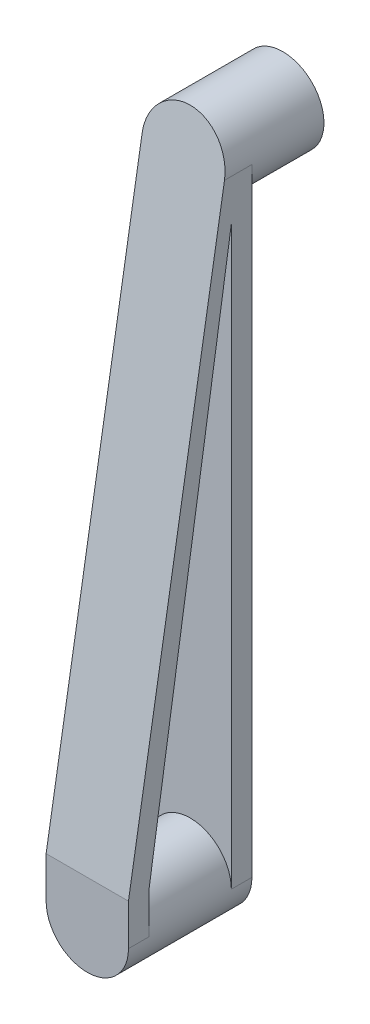
ISO-10303-21;
HEADER;
FILE_DESCRIPTION(('STEP AP214'),'2;1');
FILE_NAME('part.step','',(''),(''),'','','');
FILE_SCHEMA(('AUTOMOTIVE_DESIGN { 1 0 10303 214 1 1 1 1 }'));
ENDSEC;
DATA;
#1=APPLICATION_CONTEXT('core data for automotive mechanical design processes');
#2=APPLICATION_PROTOCOL_DEFINITION('international standard','automotive_design',2000,#1);
#3=PRODUCT_CONTEXT('',#1,'mechanical');
#4=PRODUCT('Part','Part','',(#3));
#5=PRODUCT_RELATED_PRODUCT_CATEGORY('part','',(#4));
#6=PRODUCT_DEFINITION_FORMATION('','',#4);
#7=PRODUCT_DEFINITION_CONTEXT('part definition',#1,'design');
#8=PRODUCT_DEFINITION('design','',#6,#7);
#9=PRODUCT_DEFINITION_SHAPE('','',#8);
#10=(LENGTH_UNIT() NAMED_UNIT(*) SI_UNIT(.MILLI.,.METRE.));
#11=(NAMED_UNIT(*) PLANE_ANGLE_UNIT() SI_UNIT($,.RADIAN.));
#12=(NAMED_UNIT(*) SI_UNIT($,.STERADIAN.) SOLID_ANGLE_UNIT());
#13=UNCERTAINTY_MEASURE_WITH_UNIT(LENGTH_MEASURE(1.E-05),#10,'distance_accuracy_value','');
#14=(GEOMETRIC_REPRESENTATION_CONTEXT(3) GLOBAL_UNCERTAINTY_ASSIGNED_CONTEXT((#13)) GLOBAL_UNIT_ASSIGNED_CONTEXT((#10,
#11,#12)) REPRESENTATION_CONTEXT('',''));
#15=CARTESIAN_POINT('',(0.,0.,0.));
#16=DIRECTION('',(0.,0.,1.));
#17=DIRECTION('',(1.,0.,0.));
#18=AXIS2_PLACEMENT_3D('',#15,#16,#17);
#19=CARTESIAN_POINT('',(0.,300.,-35.));
#20=DIRECTION('',(0.,0.,-1.));
#21=DIRECTION('',(-1.,0.,0.));
#22=AXIS2_PLACEMENT_3D('',#19,#20,#21);
#23=PLANE('',#22);
#24=CARTESIAN_POINT('',(0.,300.,-35.));
#25=DIRECTION('',(0.,0.,-1.));
#26=DIRECTION('',(-1.,0.,0.));
#27=AXIS2_PLACEMENT_3D('',#24,#25,#26);
#28=CIRCLE('',#27,20.);
#29=CARTESIAN_POINT('',(-20.,300.,-35.));
#30=VERTEX_POINT('',#29);
#31=EDGE_CURVE('E189',#30,#30,#28,.F.);
#32=ORIENTED_EDGE('',*,*,#31,.F.);
#33=EDGE_LOOP('',(#32));
#34=FACE_BOUND('',#33,.T.);
#35=ADVANCED_FACE('F17',(#34),#23,.T.);
#36=CARTESIAN_POINT('',(-20.,20.,50.));
#37=DIRECTION('',(0.,-0.152057184253941,-0.988371697650617));
#38=DIRECTION('',(0.,0.988371697650617,-0.152057184253941));
#39=AXIS2_PLACEMENT_3D('',#36,#37,#38);
#40=PLANE('',#39);
#41=DIRECTION('',(0.,-0.988371697650617,0.152057184253941));
#42=VECTOR('',#41,1.);
#43=CARTESIAN_POINT('',(-20.,280.,10.));
#44=LINE('',#43,#42);
#45=CARTESIAN_POINT('',(-20.,280.000000000002,9.99999999999988));
#46=VERTEX_POINT('',#45);
#47=CARTESIAN_POINT('',(-20.,19.9999999999999,50.));
#48=VERTEX_POINT('',#47);
#49=EDGE_CURVE('E104',#46,#48,#44,.T.);
#50=ORIENTED_EDGE('',*,*,#49,.F.);
#51=DIRECTION('',(1.,0.,0.));
#52=VECTOR('',#51,1.);
#53=CARTESIAN_POINT('',(14.1594181297334,280.,10.));
#54=LINE('',#53,#52);
#55=CARTESIAN_POINT('',(20.,280.,10.));
#56=VERTEX_POINT('',#55);
#57=EDGE_CURVE('E151',#56,#46,#54,.F.);
#58=ORIENTED_EDGE('',*,*,#57,.F.);
#59=DIRECTION('',(0.,0.988371697650617,-0.152057184253941));
#60=VECTOR('',#59,1.);
#61=CARTESIAN_POINT('',(20.,20.,50.));
#62=LINE('',#61,#60);
#63=CARTESIAN_POINT('',(20.,20.0000000000004,50.));
#64=VERTEX_POINT('',#63);
#65=EDGE_CURVE('E86',#64,#56,#62,.T.);
#66=ORIENTED_EDGE('',*,*,#65,.F.);
#67=DIRECTION('',(1.,0.,0.));
#68=VECTOR('',#67,1.);
#69=CARTESIAN_POINT('',(0.,20.,50.));
#70=LINE('',#69,#68);
#71=CARTESIAN_POINT('',(0.,20.,50.));
#72=VERTEX_POINT('',#71);
#73=EDGE_CURVE('E95',#64,#72,#70,.F.);
#74=ORIENTED_EDGE('',*,*,#73,.T.);
#75=DIRECTION('',(1.,0.,0.));
#76=VECTOR('',#75,1.);
#77=CARTESIAN_POINT('',(0.,20.,50.));
#78=LINE('',#77,#76);
#79=EDGE_CURVE('E116',#72,#48,#78,.F.);
#80=ORIENTED_EDGE('',*,*,#79,.T.);
#81=EDGE_LOOP('',(#50,#58,#66,#74,#80));
#82=FACE_BOUND('',#81,.T.);
#83=ADVANCED_FACE('F117',(#82),#40,.T.);
#84=CARTESIAN_POINT('',(-20.,320.,10.));
#85=DIRECTION('',(0.,0.164398987305357,0.986393923832144));
#86=DIRECTION('',(0.,-0.986393923832144,0.164398987305357));
#87=AXIS2_PLACEMENT_3D('',#84,#85,#86);
#88=PLANE('',#87);
#89=DIRECTION('',(1.,0.,0.));
#90=VECTOR('',#89,1.);
#91=CARTESIAN_POINT('',(0.,20.,60.));
#92=LINE('',#91,#90);
#93=CARTESIAN_POINT('',(20.,19.9999999999994,60.0000000000001));
#94=VERTEX_POINT('',#93);
#95=CARTESIAN_POINT('',(-20.,20.,60.));
#96=VERTEX_POINT('',#95);
#97=EDGE_CURVE('E121',#94,#96,#92,.F.);
#98=ORIENTED_EDGE('',*,*,#97,.F.);
#99=DIRECTION('',(0.,-0.986393923832144,0.164398987305357));
#100=VECTOR('',#99,1.);
#101=CARTESIAN_POINT('',(20.,300.,13.3333333333333));
#102=LINE('',#101,#100);
#103=CARTESIAN_POINT('',(20.,300.,13.3333333333333));
#104=VERTEX_POINT('',#103);
#105=EDGE_CURVE('E80',#104,#94,#102,.T.);
#106=ORIENTED_EDGE('',*,*,#105,.F.);
#107=CARTESIAN_POINT('',(0.,300.,13.3333333333333));
#108=DIRECTION('',(0.,0.164398987305357,0.986393923832144));
#109=DIRECTION('',(0.,0.986393923832144,-0.164398987305357));
#110=AXIS2_PLACEMENT_3D('',#107,#108,#109);
#111=ELLIPSE('',#110,20.2758751009941,20.);
#112=CARTESIAN_POINT('',(-20.,300.,13.3333333333333));
#113=VERTEX_POINT('',#112);
#114=EDGE_CURVE('E20',#113,#104,#111,.F.);
#115=ORIENTED_EDGE('',*,*,#114,.F.);
#116=DIRECTION('',(0.,0.986393923832144,-0.164398987305357));
#117=VECTOR('',#116,1.);
#118=CARTESIAN_POINT('',(-20.,20.,60.));
#119=LINE('',#118,#117);
#120=EDGE_CURVE('E127',#96,#113,#119,.T.);
#121=ORIENTED_EDGE('',*,*,#120,.F.);
#122=EDGE_LOOP('',(#98,#106,#115,#121));
#123=FACE_BOUND('',#122,.T.);
#124=ADVANCED_FACE('F238',(#123),#88,.T.);
#125=CARTESIAN_POINT('',(14.1594181297334,14.1594181297334,10.));
#126=DIRECTION('',(0.,0.,1.));
#127=DIRECTION('',(1.,0.,0.));
#128=AXIS2_PLACEMENT_3D('',#125,#126,#127);
#129=PLANE('',#128);
#130=CARTESIAN_POINT('',(0.,0.,10.));
#131=DIRECTION('',(0.,0.,1.));
#132=DIRECTION('',(1.,0.,0.));
#133=AXIS2_PLACEMENT_3D('',#130,#131,#132);
#134=CIRCLE('',#133,20.);
#135=CARTESIAN_POINT('',(20.,0.,10.));
#136=VERTEX_POINT('',#135);
#137=CARTESIAN_POINT('',(-20.,0.,10.));
#138=VERTEX_POINT('',#137);
#139=EDGE_CURVE('E164',#136,#138,#134,.T.);
#140=ORIENTED_EDGE('',*,*,#139,.F.);
#141=DIRECTION('',(0.,1.,0.));
#142=VECTOR('',#141,1.);
#143=CARTESIAN_POINT('',(20.,-20.,10.));
#144=LINE('',#143,#142);
#145=EDGE_CURVE('E154',#56,#136,#144,.F.);
#146=ORIENTED_EDGE('',*,*,#145,.F.);
#147=ORIENTED_EDGE('',*,*,#57,.T.);
#148=DIRECTION('',(0.,1.,0.));
#149=VECTOR('',#148,1.);
#150=CARTESIAN_POINT('',(-20.,20.,10.));
#151=LINE('',#150,#149);
#152=EDGE_CURVE('E113',#138,#46,#151,.T.);
#153=ORIENTED_EDGE('',*,*,#152,.F.);
#154=EDGE_LOOP('',(#140,#146,#147,#153));
#155=FACE_BOUND('',#154,.T.);
#156=ADVANCED_FACE('F235',(#155),#129,.T.);
#157=CARTESIAN_POINT('',(0.,0.,50.));
#158=DIRECTION('',(0.,0.,1.));
#159=DIRECTION('',(1.,0.,0.));
#160=AXIS2_PLACEMENT_3D('',#157,#158,#159);
#161=PLANE('',#160);
#162=ORIENTED_EDGE('',*,*,#73,.F.);
#163=DIRECTION('',(0.,1.,0.));
#164=VECTOR('',#163,1.);
#165=CARTESIAN_POINT('',(20.,-20.,50.));
#166=LINE('',#165,#164);
#167=CARTESIAN_POINT('',(20.,0.,50.));
#168=VERTEX_POINT('',#167);
#169=EDGE_CURVE('E144',#168,#64,#166,.T.);
#170=ORIENTED_EDGE('',*,*,#169,.F.);
#171=CARTESIAN_POINT('',(0.,0.,50.));
#172=DIRECTION('',(0.,0.,1.));
#173=DIRECTION('',(1.,0.,0.));
#174=AXIS2_PLACEMENT_3D('',#171,#172,#173);
#175=CIRCLE('',#174,20.);
#176=EDGE_CURVE('E141',#72,#168,#175,.F.);
#177=ORIENTED_EDGE('',*,*,#176,.F.);
#178=EDGE_LOOP('',(#162,#170,#177));
#179=FACE_BOUND('',#178,.T.);
#180=ADVANCED_FACE('F237',(#179),#161,.F.);
#181=CARTESIAN_POINT('',(0.,0.,60.));
#182=DIRECTION('',(0.,0.,1.));
#183=DIRECTION('',(1.,0.,0.));
#184=AXIS2_PLACEMENT_3D('',#181,#182,#183);
#185=PLANE('',#184);
#186=ORIENTED_EDGE('',*,*,#97,.T.);
#187=DIRECTION('',(0.,1.,0.));
#188=VECTOR('',#187,1.);
#189=CARTESIAN_POINT('',(-20.,20.,60.));
#190=LINE('',#189,#188);
#191=CARTESIAN_POINT('',(-20.,0.,60.));
#192=VERTEX_POINT('',#191);
#193=EDGE_CURVE('E125',#192,#96,#190,.T.);
#194=ORIENTED_EDGE('',*,*,#193,.F.);
#195=CARTESIAN_POINT('',(0.,0.,60.));
#196=DIRECTION('',(0.,0.,1.));
#197=DIRECTION('',(1.,0.,0.));
#198=AXIS2_PLACEMENT_3D('',#195,#196,#197);
#199=CIRCLE('',#198,20.);
#200=CARTESIAN_POINT('',(20.,0.,60.));
#201=VERTEX_POINT('',#200);
#202=EDGE_CURVE('E140',#201,#192,#199,.F.);
#203=ORIENTED_EDGE('',*,*,#202,.F.);
#204=DIRECTION('',(0.,1.,0.));
#205=VECTOR('',#204,1.);
#206=CARTESIAN_POINT('',(20.,-20.,60.));
#207=LINE('',#206,#205);
#208=EDGE_CURVE('E142',#94,#201,#207,.F.);
#209=ORIENTED_EDGE('',*,*,#208,.F.);
#210=EDGE_LOOP('',(#186,#194,#203,#209));
#211=FACE_BOUND('',#210,.T.);
#212=ADVANCED_FACE('F244',(#211),#185,.T.);
#213=CARTESIAN_POINT('',(0.,0.,50.));
#214=DIRECTION('',(0.,0.,1.));
#215=DIRECTION('',(1.,0.,0.));
#216=AXIS2_PLACEMENT_3D('',#213,#214,#215);
#217=PLANE('',#216);
#218=DIRECTION('',(0.,1.,0.));
#219=VECTOR('',#218,1.);
#220=CARTESIAN_POINT('',(-20.,20.,50.));
#221=LINE('',#220,#219);
#222=CARTESIAN_POINT('',(-20.,0.,50.));
#223=VERTEX_POINT('',#222);
#224=EDGE_CURVE('E110',#48,#223,#221,.F.);
#225=ORIENTED_EDGE('',*,*,#224,.F.);
#226=ORIENTED_EDGE('',*,*,#79,.F.);
#227=CARTESIAN_POINT('',(0.,0.,50.));
#228=DIRECTION('',(0.,0.,1.));
#229=DIRECTION('',(1.,0.,0.));
#230=AXIS2_PLACEMENT_3D('',#227,#228,#229);
#231=CIRCLE('',#230,20.);
#232=EDGE_CURVE('E124',#223,#72,#231,.F.);
#233=ORIENTED_EDGE('',*,*,#232,.F.);
#234=EDGE_LOOP('',(#225,#226,#233));
#235=FACE_BOUND('',#234,.T.);
#236=ADVANCED_FACE('F123',(#235),#217,.F.);
#237=CARTESIAN_POINT('',(20.,-20.,50.));
#238=DIRECTION('',(1.,0.,0.));
#239=DIRECTION('',(0.,0.,-1.));
#240=AXIS2_PLACEMENT_3D('',#237,#238,#239);
#241=PLANE('',#240);
#242=DIRECTION('',(0.,0.,1.));
#243=VECTOR('',#242,1.);
#244=CARTESIAN_POINT('',(20.,0.,0.));
#245=LINE('',#244,#243);
#246=CARTESIAN_POINT('',(20.,0.,0.));
#247=VERTEX_POINT('',#246);
#248=EDGE_CURVE('E188',#247,#136,#245,.T.);
#249=ORIENTED_EDGE('',*,*,#248,.F.);
#250=DIRECTION('',(0.,1.,0.));
#251=VECTOR('',#250,1.);
#252=CARTESIAN_POINT('',(20.,0.,0.));
#253=LINE('',#252,#251);
#254=CARTESIAN_POINT('',(20.,300.,0.));
#255=VERTEX_POINT('',#254);
#256=EDGE_CURVE('E184',#247,#255,#253,.T.);
#257=ORIENTED_EDGE('',*,*,#256,.T.);
#258=DIRECTION('',(0.,0.,-1.));
#259=VECTOR('',#258,1.);
#260=CARTESIAN_POINT('',(20.,300.,10.));
#261=LINE('',#260,#259);
#262=EDGE_CURVE('E156',#104,#255,#261,.T.);
#263=ORIENTED_EDGE('',*,*,#262,.F.);
#264=ORIENTED_EDGE('',*,*,#105,.T.);
#265=ORIENTED_EDGE('',*,*,#208,.T.);
#266=DIRECTION('',(0.,0.,1.));
#267=VECTOR('',#266,1.);
#268=CARTESIAN_POINT('',(20.,0.,0.));
#269=LINE('',#268,#267);
#270=EDGE_CURVE('E137',#168,#201,#269,.T.);
#271=ORIENTED_EDGE('',*,*,#270,.F.);
#272=ORIENTED_EDGE('',*,*,#169,.T.);
#273=ORIENTED_EDGE('',*,*,#65,.T.);
#274=ORIENTED_EDGE('',*,*,#145,.T.);
#275=EDGE_LOOP('',(#249,#257,#263,#264,#265,#271,#272,#273,#274));
#276=FACE_BOUND('',#275,.T.);
#277=ADVANCED_FACE('F212',(#276),#241,.T.);
#278=CARTESIAN_POINT('',(0.,300.,10.));
#279=DIRECTION('',(0.,0.,-1.));
#280=DIRECTION('',(-1.,0.,0.));
#281=AXIS2_PLACEMENT_3D('',#278,#279,#280);
#282=CYLINDRICAL_SURFACE('',#281,20.);
#283=ORIENTED_EDGE('',*,*,#31,.T.);
#284=EDGE_LOOP('',(#283));
#285=FACE_BOUND('',#284,.T.);
#286=DIRECTION('',(0.,0.,1.));
#287=VECTOR('',#286,1.);
#288=CARTESIAN_POINT('',(-20.,300.,50.));
#289=LINE('',#288,#287);
#290=CARTESIAN_POINT('',(-20.,300.,0.));
#291=VERTEX_POINT('',#290);
#292=EDGE_CURVE('E160',#113,#291,#289,.F.);
#293=ORIENTED_EDGE('',*,*,#292,.F.);
#294=ORIENTED_EDGE('',*,*,#114,.T.);
#295=ORIENTED_EDGE('',*,*,#262,.T.);
#296=CARTESIAN_POINT('',(0.,300.,0.));
#297=DIRECTION('',(0.,0.,-1.));
#298=DIRECTION('',(-1.,0.,0.));
#299=AXIS2_PLACEMENT_3D('',#296,#297,#298);
#300=CIRCLE('',#299,20.);
#301=EDGE_CURVE('E181',#255,#291,#300,.T.);
#302=ORIENTED_EDGE('',*,*,#301,.T.);
#303=EDGE_LOOP('',(#293,#294,#295,#302));
#304=FACE_BOUND('',#303,.T.);
#305=ADVANCED_FACE('F210',(#285,#304),#282,.T.);
#306=CARTESIAN_POINT('',(-20.,20.,50.));
#307=DIRECTION('',(-1.,0.,0.));
#308=DIRECTION('',(0.,0.,1.));
#309=AXIS2_PLACEMENT_3D('',#306,#307,#308);
#310=PLANE('',#309);
#311=ORIENTED_EDGE('',*,*,#193,.T.);
#312=ORIENTED_EDGE('',*,*,#120,.T.);
#313=ORIENTED_EDGE('',*,*,#292,.T.);
#314=DIRECTION('',(0.,1.,0.));
#315=VECTOR('',#314,1.);
#316=CARTESIAN_POINT('',(-20.,0.,0.));
#317=LINE('',#316,#315);
#318=CARTESIAN_POINT('',(-20.,0.,0.));
#319=VERTEX_POINT('',#318);
#320=EDGE_CURVE('E26',#291,#319,#317,.F.);
#321=ORIENTED_EDGE('',*,*,#320,.T.);
#322=DIRECTION('',(0.,0.,1.));
#323=VECTOR('',#322,1.);
#324=CARTESIAN_POINT('',(-20.,0.,0.));
#325=LINE('',#324,#323);
#326=EDGE_CURVE('E34',#138,#319,#325,.F.);
#327=ORIENTED_EDGE('',*,*,#326,.F.);
#328=ORIENTED_EDGE('',*,*,#152,.T.);
#329=ORIENTED_EDGE('',*,*,#49,.T.);
#330=ORIENTED_EDGE('',*,*,#224,.T.);
#331=DIRECTION('',(0.,0.,1.));
#332=VECTOR('',#331,1.);
#333=CARTESIAN_POINT('',(-20.,0.,0.));
#334=LINE('',#333,#332);
#335=EDGE_CURVE('E131',#192,#223,#334,.F.);
#336=ORIENTED_EDGE('',*,*,#335,.F.);
#337=EDGE_LOOP('',(#311,#312,#313,#321,#327,#328,#329,#330,#336));
#338=FACE_BOUND('',#337,.T.);
#339=ADVANCED_FACE('F107',(#338),#310,.T.);
#340=CARTESIAN_POINT('',(0.,0.,0.));
#341=DIRECTION('',(0.,0.,1.));
#342=DIRECTION('',(1.,0.,0.));
#343=AXIS2_PLACEMENT_3D('',#340,#341,#342);
#344=CYLINDRICAL_SURFACE('',#343,20.);
#345=ORIENTED_EDGE('',*,*,#335,.T.);
#346=ORIENTED_EDGE('',*,*,#232,.T.);
#347=ORIENTED_EDGE('',*,*,#176,.T.);
#348=ORIENTED_EDGE('',*,*,#270,.T.);
#349=ORIENTED_EDGE('',*,*,#202,.T.);
#350=EDGE_LOOP('',(#345,#346,#347,#348,#349));
#351=FACE_BOUND('',#350,.T.);
#352=CARTESIAN_POINT('',(0.,0.,0.));
#353=DIRECTION('',(0.,0.,1.));
#354=DIRECTION('',(1.,0.,0.));
#355=AXIS2_PLACEMENT_3D('',#352,#353,#354);
#356=CIRCLE('',#355,20.);
#357=EDGE_CURVE('E11',#319,#247,#356,.T.);
#358=ORIENTED_EDGE('',*,*,#357,.T.);
#359=ORIENTED_EDGE('',*,*,#248,.T.);
#360=ORIENTED_EDGE('',*,*,#139,.T.);
#361=ORIENTED_EDGE('',*,*,#326,.T.);
#362=EDGE_LOOP('',(#358,#359,#360,#361));
#363=FACE_BOUND('',#362,.T.);
#364=ADVANCED_FACE('F219',(#351,#363),#344,.T.);
#365=CARTESIAN_POINT('',(0.,0.,0.));
#366=DIRECTION('',(0.,0.,1.));
#367=DIRECTION('',(1.,0.,0.));
#368=AXIS2_PLACEMENT_3D('',#365,#366,#367);
#369=PLANE('',#368);
#370=ORIENTED_EDGE('',*,*,#320,.F.);
#371=ORIENTED_EDGE('',*,*,#301,.F.);
#372=ORIENTED_EDGE('',*,*,#256,.F.);
#373=ORIENTED_EDGE('',*,*,#357,.F.);
#374=EDGE_LOOP('',(#370,#371,#372,#373));
#375=FACE_BOUND('',#374,.T.);
#376=ADVANCED_FACE('F209',(#375),#369,.F.);
#377=CLOSED_SHELL('',(#35,#83,#124,#156,#180,#212,#236,#277,#305,#339,#364,#376));
#378=MANIFOLD_SOLID_BREP('B1',#377);
#379=ADVANCED_BREP_SHAPE_REPRESENTATION('',(#18,#378),#14);
#380=SHAPE_DEFINITION_REPRESENTATION(#9,#379);
ENDSEC;
END-ISO-10303-21;
